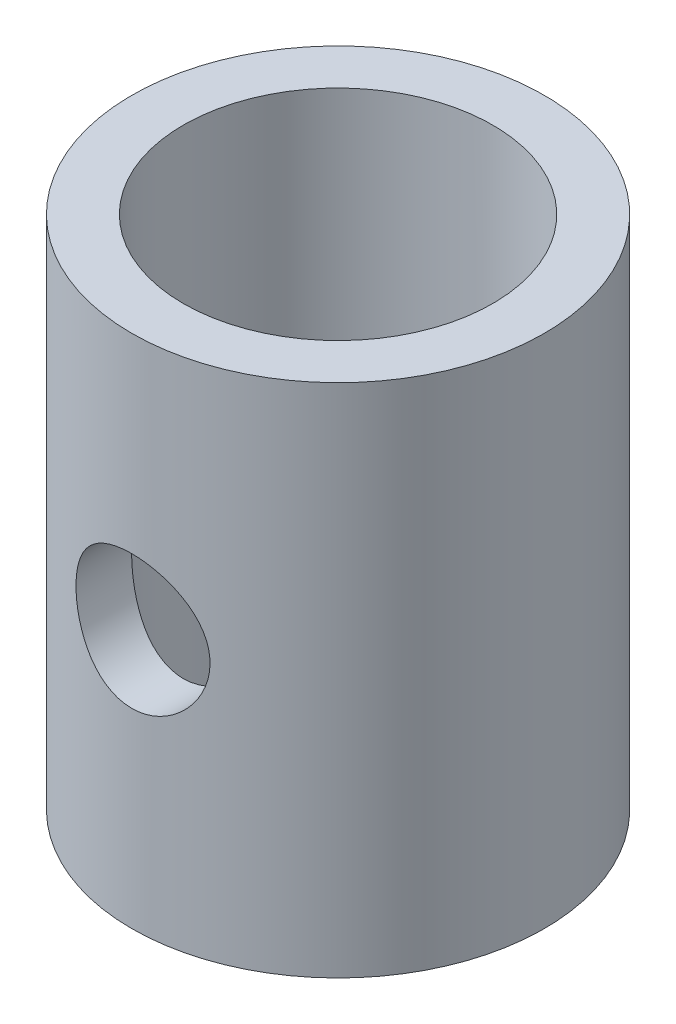
ISO-10303-21;
HEADER;
FILE_DESCRIPTION(('STEP AP214'),'2;1');
FILE_NAME('part.step','',(''),(''),'','','');
FILE_SCHEMA(('AUTOMOTIVE_DESIGN { 1 0 10303 214 1 1 1 1 }'));
ENDSEC;
DATA;
#1=APPLICATION_CONTEXT('core data for automotive mechanical design processes');
#2=APPLICATION_PROTOCOL_DEFINITION('international standard','automotive_design',2000,#1);
#3=PRODUCT_CONTEXT('',#1,'mechanical');
#4=PRODUCT('Part','Part','',(#3));
#5=PRODUCT_RELATED_PRODUCT_CATEGORY('part','',(#4));
#6=PRODUCT_DEFINITION_FORMATION('','',#4);
#7=PRODUCT_DEFINITION_CONTEXT('part definition',#1,'design');
#8=PRODUCT_DEFINITION('design','',#6,#7);
#9=PRODUCT_DEFINITION_SHAPE('','',#8);
#10=(LENGTH_UNIT() NAMED_UNIT(*) SI_UNIT(.MILLI.,.METRE.));
#11=(NAMED_UNIT(*) PLANE_ANGLE_UNIT() SI_UNIT($,.RADIAN.));
#12=(NAMED_UNIT(*) SI_UNIT($,.STERADIAN.) SOLID_ANGLE_UNIT());
#13=UNCERTAINTY_MEASURE_WITH_UNIT(LENGTH_MEASURE(1.E-05),#10,'distance_accuracy_value','');
#14=(GEOMETRIC_REPRESENTATION_CONTEXT(3) GLOBAL_UNCERTAINTY_ASSIGNED_CONTEXT((#13)) GLOBAL_UNIT_ASSIGNED_CONTEXT((#10,
#11,#12)) REPRESENTATION_CONTEXT('',''));
#15=CARTESIAN_POINT('',(0.,0.,0.));
#16=DIRECTION('',(0.,0.,1.));
#17=DIRECTION('',(1.,0.,0.));
#18=AXIS2_PLACEMENT_3D('',#15,#16,#17);
#19=CARTESIAN_POINT('',(0.,5.,0.));
#20=DIRECTION('',(0.,-1.,0.));
#21=DIRECTION('',(0.,0.,-1.));
#22=AXIS2_PLACEMENT_3D('',#19,#20,#21);
#23=CYLINDRICAL_SURFACE('',#22,2.);
#24=CARTESIAN_POINT('',(0.,3.15,-2.));
#25=CARTESIAN_POINT('',(-0.0355158765898068,3.14999999577869,-1.99999997874913));
#26=CARTESIAN_POINT('',(-0.071032159885622,3.14707960730568,-1.99904515877224));
#27=CARTESIAN_POINT('',(-0.141021622451492,3.13550886665431,-1.99533003564843));
#28=CARTESIAN_POINT('',(-0.175494641128259,3.12685763695227,-1.99256945599897));
#29=CARTESIAN_POINT('',(-0.242378365360448,3.10415095456494,-1.98554343201381));
#30=CARTESIAN_POINT('',(-0.274792316557374,3.09010426596157,-1.98128042905185));
#31=CARTESIAN_POINT('',(-0.3368045248042,3.05704406964325,-1.97168672287743));
#32=CARTESIAN_POINT('',(-0.366402269138841,3.03802965986226,-1.96635582579194));
#33=CARTESIAN_POINT('',(-0.422922162296405,2.99491178774146,-1.9549918644968));
#34=CARTESIAN_POINT('',(-0.449738074349301,2.97067336124053,-1.94894259072161));
#35=CARTESIAN_POINT('',(-0.499004688182065,2.91808260678273,-1.93691473696056));
#36=CARTESIAN_POINT('',(-0.521454490996139,2.88972943370877,-1.93093617177082));
#37=CARTESIAN_POINT('',(-0.561945602275753,2.82877259464909,-1.91955011211552));
#38=CARTESIAN_POINT('',(-0.57985100889219,2.7960745900376,-1.91416247552056));
#39=CARTESIAN_POINT('',(-0.609863774279204,2.7279280199611,-1.90481366158088));
#40=CARTESIAN_POINT('',(-0.621972803047872,2.69248025015706,-1.90085207345811));
#41=CARTESIAN_POINT('',(-0.639654521942537,2.62104480069356,-1.89497412493651));
#42=CARTESIAN_POINT('',(-0.645425482088055,2.58511143405107,-1.89299590533193));
#43=CARTESIAN_POINT('',(-0.65088691826708,2.51273620857437,-1.89112541586088));
#44=CARTESIAN_POINT('',(-0.650579164503576,2.47629450086498,-1.89123253871459));
#45=CARTESIAN_POINT('',(-0.6440463102753,2.40560698433029,-1.89346626262685));
#46=CARTESIAN_POINT('',(-0.638077183632071,2.37133428485327,-1.89550550077693));
#47=CARTESIAN_POINT('',(-0.620807564791822,2.30430605323593,-1.90123114968354));
#48=CARTESIAN_POINT('',(-0.60950646366049,2.27155069485179,-1.90491774857319));
#49=CARTESIAN_POINT('',(-0.581720808377423,2.20789394504639,-1.91358688008814));
#50=CARTESIAN_POINT('',(-0.565158577356139,2.17702918834868,-1.91858862582331));
#51=CARTESIAN_POINT('',(-0.527374730371837,2.11843481406539,-1.92931612496616));
#52=CARTESIAN_POINT('',(-0.506151822686259,2.09070606887032,-1.93504207890369));
#53=CARTESIAN_POINT('',(-0.458408813108753,2.03772883893411,-1.94691928947428));
#54=CARTESIAN_POINT('',(-0.431678597776423,2.01267091215006,-1.95307757282902));
#55=CARTESIAN_POINT('',(-0.374319189779615,1.96734498676661,-1.96487694021735));
#56=CARTESIAN_POINT('',(-0.343689659563994,1.94707740328623,-1.97051797940196));
#57=CARTESIAN_POINT('',(-0.279011992592461,1.91176408392749,-1.98071508279729));
#58=CARTESIAN_POINT('',(-0.244935502707893,1.89676711628029,-1.98526089771371));
#59=CARTESIAN_POINT('',(-0.174560700273812,1.87277649018027,-1.99268115031696));
#60=CARTESIAN_POINT('',(-0.138263124131882,1.86378085361673,-1.99555613868795));
#61=CARTESIAN_POINT('',(-0.066091459135542,1.85238053791721,-1.99922063987613));
#62=CARTESIAN_POINT('',(-0.0302621548305155,1.84971817522834,-2.0000916383685));
#63=CARTESIAN_POINT('',(0.0413369507285974,1.85032899907445,-1.99989303023965));
#64=CARTESIAN_POINT('',(0.0771067605595079,1.85360123925408,-1.99882373302569));
#65=CARTESIAN_POINT('',(0.146555402985819,1.86578322508272,-1.99491838177795));
#66=CARTESIAN_POINT('',(0.180264656874581,1.87453677482365,-1.99213131108824));
#67=CARTESIAN_POINT('',(0.245724251138497,1.8972395279742,-1.98512068628881));
#68=CARTESIAN_POINT('',(0.277474343830104,1.91118938675586,-1.98089695098905));
#69=CARTESIAN_POINT('',(0.339018110961004,1.94428545404696,-1.97130973806211));
#70=CARTESIAN_POINT('',(0.368741038696414,1.96355536497523,-1.96591988859035));
#71=CARTESIAN_POINT('',(0.424616301461646,2.0065979807944,-1.95461376535022));
#72=CARTESIAN_POINT('',(0.450767590781446,2.03037199956246,-1.94869733824346));
#73=CARTESIAN_POINT('',(0.499928194517631,2.08296019560982,-1.93668278904825));
#74=CARTESIAN_POINT('',(0.522753677952983,2.11194734825121,-1.93058781616222));
#75=CARTESIAN_POINT('',(0.563236551622519,2.17347220052731,-1.91916869839338));
#76=CARTESIAN_POINT('',(0.580893954715921,2.2060098913273,-1.91384455159264));
#77=CARTESIAN_POINT('',(0.610444930719109,2.27369050788871,-1.90462525363218));
#78=CARTESIAN_POINT('',(0.622354925689568,2.30882567613549,-1.9007260388587));
#79=CARTESIAN_POINT('',(0.640040191356299,2.38075755636102,-1.8948448768652));
#80=CARTESIAN_POINT('',(0.645818047438328,2.41755356128323,-1.89286212167358));
#81=CARTESIAN_POINT('',(0.650879709676008,2.48982802347246,-1.89112717374085));
#82=CARTESIAN_POINT('',(0.650467163249922,2.52528295859874,-1.89127068050414));
#83=CARTESIAN_POINT('',(0.643901228937028,2.59559079921997,-1.8935160339102));
#84=CARTESIAN_POINT('',(0.637748151425312,2.63044373715952,-1.8956177746765));
#85=CARTESIAN_POINT('',(0.620086141458854,2.69796642115163,-1.90146702367332));
#86=CARTESIAN_POINT('',(0.608670868549864,2.73066335735731,-1.90518568978692));
#87=CARTESIAN_POINT('',(0.580883445994,2.79370343508811,-1.91384043386138));
#88=CARTESIAN_POINT('',(0.564510231699179,2.82404606930032,-1.91877677325814));
#89=CARTESIAN_POINT('',(0.526471759395877,2.88289123669315,-1.92956817726115));
#90=CARTESIAN_POINT('',(0.504613782258219,2.91126370427506,-1.93545303504048));
#91=CARTESIAN_POINT('',(0.456557435800181,2.96403618139651,-1.94734877410382));
#92=CARTESIAN_POINT('',(0.430357866885753,2.98843508932567,-1.95335968981593));
#93=CARTESIAN_POINT('',(0.373217509634888,3.03345935964367,-1.96509250418664));
#94=CARTESIAN_POINT('',(0.34213899748535,3.05391531762857,-1.97079595508393));
#95=CARTESIAN_POINT('',(0.276800318019454,3.08928813073545,-1.98102819656445));
#96=CARTESIAN_POINT('',(0.242541149859991,3.10420671803124,-1.98555735435056));
#97=CARTESIAN_POINT('',(0.173966476139214,3.1272666071981,-1.99269931023795));
#98=CARTESIAN_POINT('',(0.13978160069477,3.13576547784011,-1.99541206151019));
#99=CARTESIAN_POINT('',(0.0703977834875378,3.14713148871449,-1.99906220015595));
#100=CARTESIAN_POINT('',(0.035199091485323,3.15000000418366,-2.00000002106132));
#101=CARTESIAN_POINT('',(0.,3.15,-2.));
#102=B_SPLINE_CURVE_WITH_KNOTS('',3,(#24,#25,#26,#27,#28,#29,#30,#31,#32,#33,#34,#35,#36,#37,
#38,#39,#40,#41,#42,#43,#44,#45,#46,#47,#48,#49,#50,#51,#52,#53,#54,#55,#56,#57,#58,#59,#60,#61,
#62,#63,#64,#65,#66,#67,#68,#69,#70,#71,#72,#73,#74,#75,#76,#77,#78,#79,#80,#81,#82,#83,#84,#85,
#86,#87,#88,#89,#90,#91,#92,#93,#94,#95,#96,#97,#98,#99,#100,#101),.UNSPECIFIED.,.T.,.F.,(4,2,2,
2,2,2,2,2,2,2,2,2,2,2,2,2,2,2,2,2,2,2,2,2,2,2,2,2,2,2,2,2,2,2,2,2,2,2,4),(0.,0.106418160250936,
0.212852619339184,0.319114918398111,0.425396526575362,0.534850592619107,0.644327171048053,
0.756769480556369,0.869179374712091,0.977962736351239,1.08671441928419,1.1907722357977,
1.29484193903693,1.40052576568224,1.50623892001293,1.61718169283519,1.72813407615525,
1.84008761111606,1.9520042265927,2.05928297451614,2.16654461684818,2.27088072291027,
2.37522999257186,2.48224636793822,2.58929400886832,2.70095208908484,2.81260989147134,
2.92394673686658,3.03523662259771,3.14108622652117,3.2469301077726,3.35095882587756,
3.45500989854221,3.56341347942179,3.67184706261094,3.78422215176912,3.89656205860428,
4.00205678906805,4.10752574881344),.UNSPECIFIED.);
#103=CARTESIAN_POINT('',(0.,3.15,-2.));
#104=VERTEX_POINT('',#103);
#105=EDGE_CURVE('E93',#104,#104,#102,.T.);
#106=ORIENTED_EDGE('',*,*,#105,.T.);
#107=EDGE_LOOP('',(#106));
#108=FACE_BOUND('',#107,.T.);
#109=CARTESIAN_POINT('',(0.650000000000001,2.5,1.89142803193777));
#110=CARTESIAN_POINT('',(0.649999993189602,2.46454009381781,1.89142806401669));
#111=CARTESIAN_POINT('',(0.647088467830224,2.42907978422197,1.89243612367389));
#112=CARTESIAN_POINT('',(0.63555612678309,2.35920615354164,1.89633978056411));
#113=CARTESIAN_POINT('',(0.626934131345964,2.32479305034072,1.89923576782987));
#114=CARTESIAN_POINT('',(0.604312817524606,2.25803677639652,1.90655336930862));
#115=CARTESIAN_POINT('',(0.590323617463,2.22568984352929,1.91097211121911));
#116=CARTESIAN_POINT('',(0.557399238778742,2.16379214237286,1.92083323940544));
#117=CARTESIAN_POINT('',(0.538463054903159,2.13424194405923,1.92627583367043));
#118=CARTESIAN_POINT('',(0.495428208823503,2.07767795957113,1.93779835313644));
#119=CARTESIAN_POINT('',(0.471176943392885,2.05078336577805,1.94389358456659));
#120=CARTESIAN_POINT('',(0.418526368989169,2.00136220657529,1.95590487377263));
#121=CARTESIAN_POINT('',(0.390126431424625,1.97883630429959,1.96182090423236));
#122=CARTESIAN_POINT('',(0.32911920559257,1.93825719881126,1.97298356456057));
#123=CARTESIAN_POINT('',(0.296425423613976,1.92032801237189,1.97821008565114));
#124=CARTESIAN_POINT('',(0.228287265587541,1.89027020762423,1.98722514836701));
#125=CARTESIAN_POINT('',(0.192843594712059,1.87814010789432,1.9910140571904));
#126=CARTESIAN_POINT('',(0.121460795092784,1.86042646418854,1.99661860252608));
#127=CARTESIAN_POINT('',(0.0855771934554534,1.85463892373788,1.99849558172132));
#128=CARTESIAN_POINT('',(0.0133024075245884,1.84912698287467,2.0002820846569));
#129=CARTESIAN_POINT('',(-0.0230886500552384,1.84940109500873,2.00019209106772));
#130=CARTESIAN_POINT('',(-0.0939047542900179,1.85587332855542,1.99809682359154));
#131=CARTESIAN_POINT('',(-0.12835249658808,1.86185005504095,1.99616313039017));
#132=CARTESIAN_POINT('',(-0.195726449280319,1.87919290165336,1.99068685889538));
#133=CARTESIAN_POINT('',(-0.228652557814501,1.89055938200498,1.98714417306544));
#134=CARTESIAN_POINT('',(-0.292543519512357,1.91849357723994,1.97875482240421));
#135=CARTESIAN_POINT('',(-0.323477886248587,1.93512598418077,1.97389205237807));
#136=CARTESIAN_POINT('',(-0.382183386257241,1.97306717902431,1.96337123184733));
#137=CARTESIAN_POINT('',(-0.409953668257849,1.99437722091571,1.95771296823192));
#138=CARTESIAN_POINT('',(-0.462861098769497,2.04219306546704,1.94590021215074));
#139=CARTESIAN_POINT('',(-0.487824081874686,2.06888916614564,1.93973484601611));
#140=CARTESIAN_POINT('',(-0.532973380709409,2.12614341810142,1.92781897271732));
#141=CARTESIAN_POINT('',(-0.553159033955555,2.15670210411193,1.92206852316738));
#142=CARTESIAN_POINT('',(-0.588405876030749,2.22134149450552,1.91157591128246));
#143=CARTESIAN_POINT('',(-0.603397261225279,2.25546271163875,1.9068477822375));
#144=CARTESIAN_POINT('',(-0.627364188256992,2.32593693544794,1.89909838897263));
#145=CARTESIAN_POINT('',(-0.6363421031256,2.36228905557722,1.89607645153061));
#146=CARTESIAN_POINT('',(-0.647680241098181,2.43451350788476,1.89223275811695));
#147=CARTESIAN_POINT('',(-0.650309155066259,2.47033892462033,1.8913217395063));
#148=CARTESIAN_POINT('',(-0.649633012486335,2.54192326034712,1.89155419984378));
#149=CARTESIAN_POINT('',(-0.646328966589634,2.57768218962548,1.89269732887772));
#150=CARTESIAN_POINT('',(-0.634121614380046,2.64692318007099,1.89682064131156));
#151=CARTESIAN_POINT('',(-0.625401409573575,2.68044148247201,1.899740690286));
#152=CARTESIAN_POINT('',(-0.602827052158292,2.74553368813477,1.90702366372403));
#153=CARTESIAN_POINT('',(-0.588972018299584,2.77710725655194,1.91138683584553));
#154=CARTESIAN_POINT('',(-0.556040058071304,2.83848063312687,1.92122944319774));
#155=CARTESIAN_POINT('',(-0.536816715791188,2.8681969391449,1.92673887276674));
#156=CARTESIAN_POINT('',(-0.493861763915945,2.92407944686794,1.93819345148473));
#157=CARTESIAN_POINT('',(-0.470128889016011,2.95024464864754,1.94413872263587));
#158=CARTESIAN_POINT('',(-0.417549016053199,2.99950818682432,1.95612142793144));
#159=CARTESIAN_POINT('',(-0.388518845951884,3.02241352582688,1.96215080601435));
#160=CARTESIAN_POINT('',(-0.326879463237591,3.06303811254468,1.97335491236984));
#161=CARTESIAN_POINT('',(-0.294270394788385,3.08075756905025,1.97852967504667));
#162=CARTESIAN_POINT('',(-0.226578692607218,3.11034121030946,1.98741489130068));
#163=CARTESIAN_POINT('',(-0.191514987613614,3.12224554420766,1.99113534904801));
#164=CARTESIAN_POINT('',(-0.11973950692184,3.13994328491688,1.99673634413692));
#165=CARTESIAN_POINT('',(-0.0830282980797956,3.14573877704151,1.99861750932332));
#166=CARTESIAN_POINT('',(-0.0107696676664906,3.1508739852095,2.00028291489001));
#167=CARTESIAN_POINT('',(0.0247561592945366,3.15049143177356,2.00015736855335));
#168=CARTESIAN_POINT('',(0.0952140014942864,3.14396102411306,1.9980431217392));
#169=CARTESIAN_POINT('',(0.130146060762339,3.13781359928343,1.99605456002791));
#170=CARTESIAN_POINT('',(0.197924177515216,3.12010935634769,1.9904690037441));
#171=CARTESIAN_POINT('',(0.230793101373707,3.1086320787056,1.98689569341655));
#172=CARTESIAN_POINT('',(0.294152833600783,3.08066677589868,1.9785086700661));
#173=CARTESIAN_POINT('',(0.324643218531405,3.06417786108675,1.97369473683554));
#174=CARTESIAN_POINT('',(0.383568378308137,3.02597710948177,1.96311075632378));
#175=CARTESIAN_POINT('',(0.411890624595752,3.00409955847767,1.95731267009106));
#176=CARTESIAN_POINT('',(0.464553260223492,2.95602861897446,1.94548710925224));
#177=CARTESIAN_POINT('',(0.488892406514007,2.92983388826536,1.93945956375691));
#178=CARTESIAN_POINT('',(0.533802575455571,2.87272243780449,1.92759302790391));
#179=CARTESIAN_POINT('',(0.55420269047779,2.84166778549206,1.92176905725867));
#180=CARTESIAN_POINT('',(0.589476606949402,2.77639181137343,1.91124511764975));
#181=CARTESIAN_POINT('',(0.604352183535406,2.74217151117083,1.90654478781271));
#182=CARTESIAN_POINT('',(0.627338988906088,2.67369158317591,1.89910066973352));
#183=CARTESIAN_POINT('',(0.635810210803049,2.63956401814361,1.89625426248952));
#184=CARTESIAN_POINT('',(0.647139872563354,2.57029089380352,1.8924182079412));
#185=CARTESIAN_POINT('',(0.650000006750044,2.5351456450492,1.89142800014315));
#186=CARTESIAN_POINT('',(0.650000000000001,2.5,1.89142803193777));
#187=B_SPLINE_CURVE_WITH_KNOTS('',3,(#109,#110,#111,#112,#113,#114,#115,#116,#117,#118,#119,
#120,#121,#122,#123,#124,#125,#126,#127,#128,#129,#130,#131,#132,#133,#134,#135,#136,#137,#138,
#139,#140,#141,#142,#143,#144,#145,#146,#147,#148,#149,#150,#151,#152,#153,#154,#155,#156,#157,
#158,#159,#160,#161,#162,#163,#164,#165,#166,#167,#168,#169,#170,#171,#172,#173,#174,#175,#176,
#177,#178,#179,#180,#181,#182,#183,#184,#185,#186),.UNSPECIFIED.,.T.,.F.,(4,2,2,2,2,2,2,2,2,2,2,
2,2,2,2,2,2,2,2,2,2,2,2,2,2,2,2,2,2,2,2,2,2,2,2,2,2,2,4),(0.,0.106249700991704,
0.212521359393549,0.318593649792456,0.424687511422907,0.534360377063011,0.644049877198545,
0.756444745939535,0.868810887178172,0.97744605945599,1.08605457432307,1.19061111438894,
1.29517464348684,1.40107612876407,1.5070060390486,1.61769122178058,1.72839174450133,
1.84052694915341,1.95261787697844,2.05987488883136,2.16711363169915,2.27091073567203,
2.37472566177228,2.48170781683889,2.58872003388124,2.70058728301536,2.81245002760983,
2.92352912459786,3.03457029134466,3.14063412892824,3.2466900670025,3.35121176686623,
3.45575203187919,3.56403138522313,3.67234446631316,3.78462942622087,3.89687827560971,
4.00221815879151,4.10752622865645),.UNSPECIFIED.);
#188=CARTESIAN_POINT('',(0.650000000000001,2.5,1.89142803193777));
#189=VERTEX_POINT('',#188);
#190=EDGE_CURVE('E87',#189,#189,#187,.T.);
#191=ORIENTED_EDGE('',*,*,#190,.T.);
#192=EDGE_LOOP('',(#191));
#193=FACE_BOUND('',#192,.T.);
#194=CARTESIAN_POINT('',(0.,5.,0.));
#195=DIRECTION('',(0.,1.,0.));
#196=DIRECTION('',(0.,0.,1.));
#197=AXIS2_PLACEMENT_3D('',#194,#195,#196);
#198=CIRCLE('',#197,2.);
#199=CARTESIAN_POINT('',(0.,5.,2.));
#200=VERTEX_POINT('',#199);
#201=EDGE_CURVE('E10',#200,#200,#198,.T.);
#202=ORIENTED_EDGE('',*,*,#201,.F.);
#203=EDGE_LOOP('',(#202));
#204=FACE_BOUND('',#203,.T.);
#205=CARTESIAN_POINT('',(0.,0.,0.));
#206=DIRECTION('',(0.,1.,0.));
#207=DIRECTION('',(0.,0.,1.));
#208=AXIS2_PLACEMENT_3D('',#205,#206,#207);
#209=CIRCLE('',#208,2.);
#210=CARTESIAN_POINT('',(0.,0.,2.));
#211=VERTEX_POINT('',#210);
#212=EDGE_CURVE('E57',#211,#211,#209,.T.);
#213=ORIENTED_EDGE('',*,*,#212,.T.);
#214=EDGE_LOOP('',(#213));
#215=FACE_BOUND('',#214,.T.);
#216=ADVANCED_FACE('F43',(#108,#193,#204,#215),#23,.T.);
#217=CARTESIAN_POINT('',(0.,5.,0.));
#218=DIRECTION('',(0.,1.,0.));
#219=DIRECTION('',(0.,0.,1.));
#220=AXIS2_PLACEMENT_3D('',#217,#218,#219);
#221=PLANE('',#220);
#222=CARTESIAN_POINT('',(0.,5.,0.));
#223=DIRECTION('',(0.,1.,0.));
#224=DIRECTION('',(0.,0.,1.));
#225=AXIS2_PLACEMENT_3D('',#222,#223,#224);
#226=CIRCLE('',#225,1.5);
#227=CARTESIAN_POINT('',(0.,5.,1.5));
#228=VERTEX_POINT('',#227);
#229=EDGE_CURVE('E66',#228,#228,#226,.T.);
#230=ORIENTED_EDGE('',*,*,#229,.F.);
#231=EDGE_LOOP('',(#230));
#232=FACE_BOUND('',#231,.T.);
#233=ORIENTED_EDGE('',*,*,#201,.T.);
#234=EDGE_LOOP('',(#233));
#235=FACE_BOUND('',#234,.T.);
#236=ADVANCED_FACE('F108',(#232,#235),#221,.T.);
#237=CARTESIAN_POINT('',(0.,0.,0.));
#238=DIRECTION('',(0.,1.,0.));
#239=DIRECTION('',(0.,0.,1.));
#240=AXIS2_PLACEMENT_3D('',#237,#238,#239);
#241=PLANE('',#240);
#242=CARTESIAN_POINT('',(0.,0.,0.));
#243=DIRECTION('',(0.,1.,0.));
#244=DIRECTION('',(0.,0.,1.));
#245=AXIS2_PLACEMENT_3D('',#242,#243,#244);
#246=CIRCLE('',#245,1.5);
#247=CARTESIAN_POINT('',(0.,0.,1.5));
#248=VERTEX_POINT('',#247);
#249=EDGE_CURVE('E63',#248,#248,#246,.T.);
#250=ORIENTED_EDGE('',*,*,#249,.T.);
#251=EDGE_LOOP('',(#250));
#252=FACE_BOUND('',#251,.T.);
#253=ORIENTED_EDGE('',*,*,#212,.F.);
#254=EDGE_LOOP('',(#253));
#255=FACE_BOUND('',#254,.T.);
#256=ADVANCED_FACE('F110',(#252,#255),#241,.F.);
#257=CARTESIAN_POINT('',(0.,0.,0.));
#258=DIRECTION('',(0.,1.,0.));
#259=DIRECTION('',(0.,0.,1.));
#260=AXIS2_PLACEMENT_3D('',#257,#258,#259);
#261=CYLINDRICAL_SURFACE('',#260,1.5);
#262=CARTESIAN_POINT('',(0.,1.85,1.5));
#263=CARTESIAN_POINT('',(0.0346979427841964,1.85000406025078,1.49999690180585));
#264=CARTESIAN_POINT('',(0.0694440069760877,1.85279459021913,1.49878234253121));
#265=CARTESIAN_POINT('',(0.137945883254197,1.86385453885268,1.4940406501468));
#266=CARTESIAN_POINT('',(0.171699011356231,1.87213759593084,1.49050776065298));
#267=CARTESIAN_POINT('',(0.237109707668385,1.893814005846,1.48150762392649));
#268=CARTESIAN_POINT('',(0.268774155131788,1.90718948712765,1.476047146273));
#269=CARTESIAN_POINT('',(0.329376909648128,1.93859419728496,1.46371735160723));
#270=CARTESIAN_POINT('',(0.358315917570673,1.95662222523446,1.45684839824784));
#271=CARTESIAN_POINT('',(0.414239798363492,1.99783466082912,1.441971980609));
#272=CARTESIAN_POINT('',(0.441060266706774,2.02122785683666,1.43392530263892));
#273=CARTESIAN_POINT('',(0.490540805268749,2.07206411754324,1.41776181978391));
#274=CARTESIAN_POINT('',(0.51319851592521,2.09950946331094,1.40964497784051));
#275=CARTESIAN_POINT('',(0.554927961500633,2.1594713258564,1.39376496312447));
#276=CARTESIAN_POINT('',(0.573738678317326,2.19218210955289,1.38604482359292));
#277=CARTESIAN_POINT('',(0.605517599319335,2.2606847861848,1.37246104540328));
#278=CARTESIAN_POINT('',(0.618489053202839,2.29647495212198,1.36659637467111));
#279=CARTESIAN_POINT('',(0.637528454864713,2.36822842145482,1.35781552173961));
#280=CARTESIAN_POINT('',(0.643914078501345,2.40409025910062,1.35476450037964));
#281=CARTESIAN_POINT('',(0.65058983689721,2.47649610990881,1.35157243562071));
#282=CARTESIAN_POINT('',(0.650883741881456,2.51303968711572,1.3514295923225));
#283=CARTESIAN_POINT('',(0.645605571124568,2.58248270683091,1.35395686946639));
#284=CARTESIAN_POINT('',(0.640525335208856,2.61542990125274,1.35639114726735));
#285=CARTESIAN_POINT('',(0.625473174776985,2.67994743861211,1.36339703849986));
#286=CARTESIAN_POINT('',(0.615500220007803,2.71151749004131,1.36796910207248));
#287=CARTESIAN_POINT('',(0.590748667799474,2.77321354241253,1.3788406206617));
#288=CARTESIAN_POINT('',(0.575869053105837,2.8032924164393,1.38517590735987));
#289=CARTESIAN_POINT('',(0.541798655631873,2.86064951900801,1.39885334758355));
#290=CARTESIAN_POINT('',(0.522606100288954,2.88792658930977,1.40619591460352));
#291=CARTESIAN_POINT('',(0.478381750022636,2.94155073014071,1.42188247942964));
#292=CARTESIAN_POINT('',(0.452974920009581,2.96758066835647,1.43025642021138));
#293=CARTESIAN_POINT('',(0.398080890977583,3.01512173151839,1.44649591644539));
#294=CARTESIAN_POINT('',(0.368592579205391,3.03663162010148,1.45436133239529));
#295=CARTESIAN_POINT('',(0.305341704230746,3.07503986300208,1.46896096131138));
#296=CARTESIAN_POINT('',(0.271485738666766,3.0917991102153,1.47565919026869));
#297=CARTESIAN_POINT('',(0.201070269651567,3.11927100398426,1.48688883858467));
#298=CARTESIAN_POINT('',(0.164512400139338,3.12998727165035,1.49142155532517));
#299=CARTESIAN_POINT('',(0.0923722981299341,3.14438188897231,1.49756096522619));
#300=CARTESIAN_POINT('',(0.0568898848936457,3.14848520933493,1.49934399014712));
#301=CARTESIAN_POINT('',(-0.0142988965271751,3.15081691424908,1.50035366272356));
#302=CARTESIAN_POINT('',(-0.0500051899735774,3.14904716500331,1.49958112242533));
#303=CARTESIAN_POINT('',(-0.118570914437449,3.13997794467744,1.4956793962515));
#304=CARTESIAN_POINT('',(-0.151479323964498,3.1329857484519,1.49268121876507));
#305=CARTESIAN_POINT('',(-0.215614411009529,3.11410774839047,1.48477443833837));
#306=CARTESIAN_POINT('',(-0.246840880123482,3.10222133969799,1.47986559927099));
#307=CARTESIAN_POINT('',(-0.307831064560033,3.07350827848489,1.468411862492));
#308=CARTESIAN_POINT('',(-0.33751857775239,3.05653885549834,1.46182063310802));
#309=CARTESIAN_POINT('',(-0.393731797910168,3.01829735946913,1.44769356848556));
#310=CARTESIAN_POINT('',(-0.4202561376504,2.99702343651962,1.4401573276492));
#311=CARTESIAN_POINT('',(-0.47153925721347,2.94886647815985,1.42422828782247));
#312=CARTESIAN_POINT('',(-0.496005140788107,2.92167779975476,1.41581419989122));
#313=CARTESIAN_POINT('',(-0.540118730678946,2.86346379458981,1.39958050153423));
#314=CARTESIAN_POINT('',(-0.559764991625479,2.83243732108906,1.39176106992548));
#315=CARTESIAN_POINT('',(-0.593996982747927,2.76659004272405,1.37750480588499));
#316=CARTESIAN_POINT('',(-0.60847635621698,2.73170695495771,1.3710979671023));
#317=CARTESIAN_POINT('',(-0.631223217691016,2.65963045930067,1.36077775718117));
#318=CARTESIAN_POINT('',(-0.639496394997978,2.62243920129419,1.35686210284257));
#319=CARTESIAN_POINT('',(-0.649009566801408,2.55007735162153,1.35233568020563));
#320=CARTESIAN_POINT('',(-0.65076928038103,2.51499015525745,1.3514808842003));
#321=CARTESIAN_POINT('',(-0.648615975018555,2.44503537413799,1.35251577962513));
#322=CARTESIAN_POINT('',(-0.644704014567664,2.41016774962405,1.35440495895374));
#323=CARTESIAN_POINT('',(-0.631766308923295,2.34360685911623,1.36048433879412));
#324=CARTESIAN_POINT('',(-0.623030429393944,2.31184410493614,1.36454372825119));
#325=CARTESIAN_POINT('',(-0.600989430410552,2.25023423174365,1.37439317912723));
#326=CARTESIAN_POINT('',(-0.587683005578859,2.22038766289999,1.38018373491732));
#327=CARTESIAN_POINT('',(-0.555922297390496,2.16141246774291,1.3932920407937));
#328=CARTESIAN_POINT('',(-0.53719774902634,2.13244594297005,1.4006827368625));
#329=CARTESIAN_POINT('',(-0.495494338866342,2.07790410149309,1.41597255821581));
#330=CARTESIAN_POINT('',(-0.472513816759655,2.05233011496795,1.42387188113505));
#331=CARTESIAN_POINT('',(-0.420734846362787,2.00315173124467,1.44006093083139));
#332=CARTESIAN_POINT('',(-0.391615040375149,1.97987724828108,1.4483300758107));
#333=CARTESIAN_POINT('',(-0.329585813920349,1.93851777435269,1.46369144317042));
#334=CARTESIAN_POINT('',(-0.296674683897546,1.92043513739212,1.47078313107437));
#335=CARTESIAN_POINT('',(-0.228386515724385,1.89031678676266,1.48291132771424));
#336=CARTESIAN_POINT('',(-0.193049354682739,1.87820176091295,1.48797461553018));
#337=CARTESIAN_POINT('',(-0.120631819671358,1.86021028568487,1.4955810113056));
#338=CARTESIAN_POINT('',(-0.0835571949681536,1.85431459519126,1.49813189041404));
#339=CARTESIAN_POINT('',(-0.0308730931115793,1.85054822884056,1.49976283534823));
#340=CARTESIAN_POINT('',(-0.015441311625405,1.84999819310332,1.50000137876132));
#341=CARTESIAN_POINT('',(0.,1.85,1.5));
#342=B_SPLINE_CURVE_WITH_KNOTS('',3,(#262,#263,#264,#265,#266,#267,#268,#269,#270,#271,#272,
#273,#274,#275,#276,#277,#278,#279,#280,#281,#282,#283,#284,#285,#286,#287,#288,#289,#290,#291,
#292,#293,#294,#295,#296,#297,#298,#299,#300,#301,#302,#303,#304,#305,#306,#307,#308,#309,#310,
#311,#312,#313,#314,#315,#316,#317,#318,#319,#320,#321,#322,#323,#324,#325,#326,#327,#328,#329,
#330,#331,#332,#333,#334,#335,#336,#337,#338,#339,#340,#341),.UNSPECIFIED.,.T.,.F.,(4,2,2,2,2,2,
2,2,2,2,2,2,2,2,2,2,2,2,2,2,2,2,2,2,2,2,2,2,2,2,2,2,2,2,2,2,2,2,2,4),(0.,0.104047307774891,
0.208353946214528,0.312297851561773,0.416214953455433,0.525205954434615,0.634258545095975,
0.749223555217165,0.864124505050538,0.973179178588261,1.08216635509152,1.18197666276481,
1.28180799638263,1.38383836345568,1.4859107406256,1.59738576707678,1.70889124556537,
1.82338640017983,1.93781287321796,2.04454139110081,2.1512359986117,2.25210366112611,
2.3529837932242,2.45701632531705,2.56109366187597,2.67317935388334,2.78529861859332,
2.89960816981254,3.01381280346954,3.11868027245589,3.22352817279183,3.32267047590518,
3.42184111828612,3.5272242226745,3.63264852531749,3.74665672871041,3.86071654255367,
3.97321654613228,4.08536747199612,4.13167070424043),.UNSPECIFIED.);
#343=CARTESIAN_POINT('',(0.,1.85,1.5));
#344=VERTEX_POINT('',#343);
#345=EDGE_CURVE('E47',#344,#344,#342,.T.);
#346=ORIENTED_EDGE('',*,*,#345,.T.);
#347=EDGE_LOOP('',(#346));
#348=FACE_BOUND('',#347,.T.);
#349=CARTESIAN_POINT('',(0.650000000000001,2.5,-1.35185058345958));
#350=CARTESIAN_POINT('',(0.649995742678914,2.46547544099152,-1.35185483309678));
#351=CARTESIAN_POINT('',(0.647231947517168,2.43090067202701,-1.35319256985138));
#352=CARTESIAN_POINT('',(0.636287886477359,2.36275770909672,-1.35837096831094));
#353=CARTESIAN_POINT('',(0.628093479773735,2.32919238279937,-1.36221816400894));
#354=CARTESIAN_POINT('',(0.606675695667648,2.26418112052683,-1.37188956891271));
#355=CARTESIAN_POINT('',(0.593473956748717,2.23272674122371,-1.37770526006649));
#356=CARTESIAN_POINT('',(0.56248013694607,2.17248747137974,-1.39064625943489));
#357=CARTESIAN_POINT('',(0.54468888207691,2.14370210174035,-1.39777133192262));
#358=CARTESIAN_POINT('',(0.503739181656021,2.08766091566815,-1.41306487215684));
#359=CARTESIAN_POINT('',(0.480318954703925,2.06060643529865,-1.42127050622815));
#360=CARTESIAN_POINT('',(0.429324855516506,2.01065886687052,-1.43749638497424));
#361=CARTESIAN_POINT('',(0.401749312011729,1.98776746141445,-1.44551655355084));
#362=CARTESIAN_POINT('',(0.341617323730097,1.94573881472044,-1.46092594183185));
#363=CARTESIAN_POINT('',(0.308886292310165,1.92683207594237,-1.46826697120783));
#364=CARTESIAN_POINT('',(0.240332087264041,1.89488138281089,-1.48103111043829));
#365=CARTESIAN_POINT('',(0.204510402467874,1.88183462417729,-1.48645513740451));
#366=CARTESIAN_POINT('',(0.132909422892905,1.86271630134322,-1.49450982859158));
#367=CARTESIAN_POINT('',(0.0972390660467098,1.85629646889672,-1.49727934526271));
#368=CARTESIAN_POINT('',(0.0252272531630461,1.84948484715768,-1.50021994623539));
#369=CARTESIAN_POINT('',(-0.0111138999056062,1.84909040008774,-1.50039217619103));
#370=CARTESIAN_POINT('',(-0.0808878238911293,1.85416707909161,-1.49819766014091));
#371=CARTESIAN_POINT('',(-0.114354759668146,1.85925438517927,-1.49599704828029));
#372=CARTESIAN_POINT('',(-0.179905006616946,1.87448687743746,-1.48953660420347));
#373=CARTESIAN_POINT('',(-0.211988215271023,1.88463243766738,-1.48527661969676));
#374=CARTESIAN_POINT('',(-0.274454307971212,1.90980796188944,-1.47502301597306));
#375=CARTESIAN_POINT('',(-0.30480366729087,1.92491028126452,-1.46900386972246));
#376=CARTESIAN_POINT('',(-0.362617232163963,1.95949600071269,-1.45581225167231));
#377=CARTESIAN_POINT('',(-0.390080390491153,1.9789809829893,-1.44863936362267));
#378=CARTESIAN_POINT('',(-0.44354267869049,2.02348258209969,-1.43321363070562));
#379=CARTESIAN_POINT('',(-0.469275569606292,2.04880537874489,-1.42492013604237));
#380=CARTESIAN_POINT('',(-0.516250406059124,2.10341012511362,-1.40858274081215));
#381=CARTESIAN_POINT('',(-0.537490326660313,2.13269385028133,-1.40053895417358));
#382=CARTESIAN_POINT('',(-0.57564054369216,2.19578438022124,-1.3853074760329));
#383=CARTESIAN_POINT('',(-0.592355786741591,2.22972072110699,-1.37816389612524));
#384=CARTESIAN_POINT('',(-0.61972338604588,2.30031749017114,-1.36607809000049));
#385=CARTESIAN_POINT('',(-0.630380486620409,2.33697576121218,-1.36113414184473));
#386=CARTESIAN_POINT('',(-0.644622099683165,2.40930149474954,-1.35444473330921));
#387=CARTESIAN_POINT('',(-0.648640903576931,2.44486494358471,-1.35250345341188));
#388=CARTESIAN_POINT('',(-0.650776016354393,2.51620346059443,-1.35147799393034));
#389=CARTESIAN_POINT('',(-0.648894661791124,2.55197843939911,-1.35239268333794));
#390=CARTESIAN_POINT('',(-0.63967995298262,2.62001497893634,-1.35677248879345));
#391=CARTESIAN_POINT('',(-0.632747302186359,2.652344501677,-1.36004997917786));
#392=CARTESIAN_POINT('',(-0.614169462030189,2.71534909821912,-1.36853914047494));
#393=CARTESIAN_POINT('',(-0.602523109627248,2.74602376158767,-1.3737512887123));
#394=CARTESIAN_POINT('',(-0.574285458721724,2.80635624957145,-1.38579974965021));
#395=CARTESIAN_POINT('',(-0.557499563275444,2.83591035743462,-1.39269730600632));
#396=CARTESIAN_POINT('',(-0.519647691960394,2.89193151512031,-1.40725872760422));
#397=CARTESIAN_POINT('',(-0.498579762987213,2.91839714753707,-1.41492294171794));
#398=CARTESIAN_POINT('',(-0.450545171199424,2.96995574341816,-1.43098049209342));
#399=CARTESIAN_POINT('',(-0.423219525273746,2.99471441363433,-1.43937775106728));
#400=CARTESIAN_POINT('',(-0.364614855136827,3.03936343112007,-1.45532724062351));
#401=CARTESIAN_POINT('',(-0.33333538932267,3.05925323385505,-1.46287937663602));
#402=CARTESIAN_POINT('',(-0.267358128991164,3.09364196273249,-1.47636666931449));
#403=CARTESIAN_POINT('',(-0.232641128158234,3.10810815587324,-1.48229195180229));
#404=CARTESIAN_POINT('',(-0.160941160465996,3.13088053855327,-1.49177815277024));
#405=CARTESIAN_POINT('',(-0.123959681491177,3.13919072688277,-1.49534060592888));
#406=CARTESIAN_POINT('',(-0.051755385543582,3.14888227306129,-1.49951028304732));
#407=CARTESIAN_POINT('',(-0.0166068804619066,3.15073382004406,-1.50031794802259));
#408=CARTESIAN_POINT('',(0.0534933978388718,3.14874276116293,-1.49945527427441));
#409=CARTESIAN_POINT('',(0.088445209317225,3.14490130399558,-1.49778543544512));
#410=CARTESIAN_POINT('',(0.155687714793682,3.13197028120942,-1.492264884524));
#411=CARTESIAN_POINT('',(0.18802882556856,3.12310047539951,-1.48850561607754));
#412=CARTESIAN_POINT('',(0.250744516569511,3.10061434205687,-1.47923392010609));
#413=CARTESIAN_POINT('',(0.281118738598706,3.08699715282823,-1.47372117432397));
#414=CARTESIAN_POINT('',(0.340573214044701,3.05471271828047,-1.46115548566649));
#415=CARTESIAN_POINT('',(0.369530762326457,3.03584299904558,-1.4540436348643));
#416=CARTESIAN_POINT('',(0.423994644219935,2.9938741611321,-1.43910645290491));
#417=CARTESIAN_POINT('',(0.449499574360273,2.97077333145367,-1.43128083375515));
#418=CARTESIAN_POINT('',(0.498315268208539,2.91897580287506,-1.41505900245339));
#419=CARTESIAN_POINT('',(0.521321167974175,2.88999048468057,-1.40666369935696));
#420=CARTESIAN_POINT('',(0.562199822598413,2.82832856880487,-1.39083201483147));
#421=CARTESIAN_POINT('',(0.580069532041985,2.79564979708589,-1.38339620375039));
#422=CARTESIAN_POINT('',(0.610065255139133,2.72739818183887,-1.37043370889785));
#423=CARTESIAN_POINT('',(0.622192517538107,2.69182596948819,-1.36490661013101));
#424=CARTESIAN_POINT('',(0.640129139162833,2.61888947739485,-1.3565900380314));
#425=CARTESIAN_POINT('',(0.645959692538415,2.58153165412088,-1.35379138411524));
#426=CARTESIAN_POINT('',(0.649505290927288,2.52933344782204,-1.35208777763587));
#427=CARTESIAN_POINT('',(0.650001809154283,2.51467125745927,-1.35184877757057));
#428=CARTESIAN_POINT('',(0.650000000000001,2.5,-1.35185058345958));
#429=B_SPLINE_CURVE_WITH_KNOTS('',3,(#349,#350,#351,#352,#353,#354,#355,#356,#357,#358,#359,
#360,#361,#362,#363,#364,#365,#366,#367,#368,#369,#370,#371,#372,#373,#374,#375,#376,#377,#378,
#379,#380,#381,#382,#383,#384,#385,#386,#387,#388,#389,#390,#391,#392,#393,#394,#395,#396,#397,
#398,#399,#400,#401,#402,#403,#404,#405,#406,#407,#408,#409,#410,#411,#412,#413,#414,#415,#416,
#417,#418,#419,#420,#421,#422,#423,#424,#425,#426,#427,#428),.UNSPECIFIED.,.T.,.F.,(4,2,2,2,2,2,
2,2,2,2,2,2,2,2,2,2,2,2,2,2,2,2,2,2,2,2,2,2,2,2,2,2,2,2,2,2,2,2,2,4),(0.,0.103528978921827,
0.207328602834733,0.310684689449815,0.414022187145903,0.523682171158712,0.633386378752481,
0.748311356780598,0.863181278971724,0.971648216376516,1.08006730799478,1.18136038484909,
1.28266095346799,1.38551139818692,1.48839903314289,1.5990392324159,1.70972919035466,
1.8246227074868,1.93942612353902,2.04636908696309,2.15326970468585,2.2525032457257,
2.3517612862598,2.45537571163234,2.55903750369966,2.67196757319137,2.7849102670281,
2.89852402935091,3.01206392608067,3.11714280822033,3.22220049112795,3.32298613404735,
3.42379008006574,3.52920409695069,3.63466083623379,3.74797128402841,3.86134877934128,
3.97470160838943,4.08767170143434,4.13166647929333),.UNSPECIFIED.);
#430=CARTESIAN_POINT('',(0.650000000000001,2.5,-1.35185058345958));
#431=VERTEX_POINT('',#430);
#432=EDGE_CURVE('E68',#431,#431,#429,.T.);
#433=ORIENTED_EDGE('',*,*,#432,.T.);
#434=EDGE_LOOP('',(#433));
#435=FACE_BOUND('',#434,.T.);
#436=ORIENTED_EDGE('',*,*,#249,.F.);
#437=EDGE_LOOP('',(#436));
#438=FACE_BOUND('',#437,.T.);
#439=ORIENTED_EDGE('',*,*,#229,.T.);
#440=EDGE_LOOP('',(#439));
#441=FACE_BOUND('',#440,.T.);
#442=ADVANCED_FACE('F74',(#348,#435,#438,#441),#261,.F.);
#443=CARTESIAN_POINT('',(0.,2.5,-2.));
#444=DIRECTION('',(0.,0.,1.));
#445=DIRECTION('',(1.,0.,0.));
#446=AXIS2_PLACEMENT_3D('',#443,#444,#445);
#447=CYLINDRICAL_SURFACE('',#446,0.650000000000001);
#448=ORIENTED_EDGE('',*,*,#432,.F.);
#449=EDGE_LOOP('',(#448));
#450=FACE_BOUND('',#449,.T.);
#451=ORIENTED_EDGE('',*,*,#105,.F.);
#452=EDGE_LOOP('',(#451));
#453=FACE_BOUND('',#452,.T.);
#454=ADVANCED_FACE('F77',(#450,#453),#447,.F.);
#455=ORIENTED_EDGE('',*,*,#345,.F.);
#456=EDGE_LOOP('',(#455));
#457=FACE_BOUND('',#456,.T.);
#458=ORIENTED_EDGE('',*,*,#190,.F.);
#459=EDGE_LOOP('',(#458));
#460=FACE_BOUND('',#459,.T.);
#461=ADVANCED_FACE('F80',(#457,#460),#447,.F.);
#462=CLOSED_SHELL('',(#216,#236,#256,#442,#454,#461));
#463=MANIFOLD_SOLID_BREP('B2',#462);
#464=ADVANCED_BREP_SHAPE_REPRESENTATION('',(#18,#463),#14);
#465=SHAPE_DEFINITION_REPRESENTATION(#9,#464);
ENDSEC;
END-ISO-10303-21;
